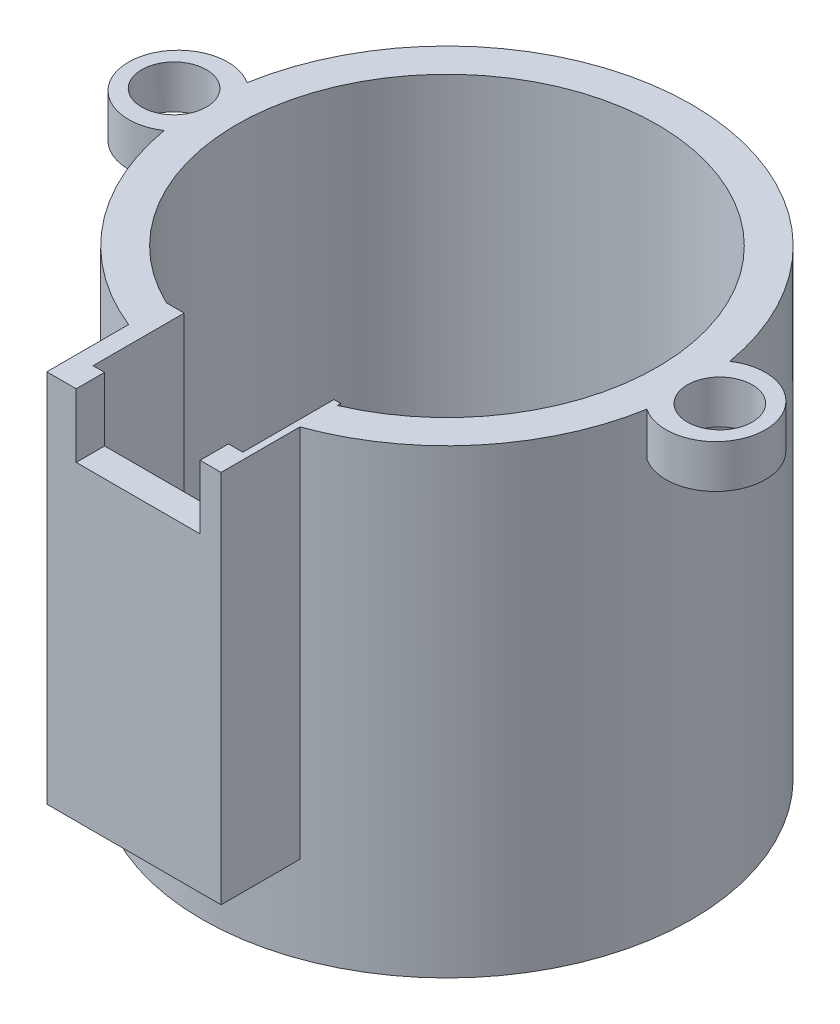
ISO-10303-21;
HEADER;
FILE_DESCRIPTION(('STEP AP214'),'2;1');
FILE_NAME('part.step','',(''),(''),'','','');
FILE_SCHEMA(('AUTOMOTIVE_DESIGN { 1 0 10303 214 1 1 1 1 }'));
ENDSEC;
DATA;
#1=APPLICATION_CONTEXT('core data for automotive mechanical design processes');
#2=APPLICATION_PROTOCOL_DEFINITION('international standard','automotive_design',2000,#1);
#3=PRODUCT_CONTEXT('',#1,'mechanical');
#4=PRODUCT('Part','Part','',(#3));
#5=PRODUCT_RELATED_PRODUCT_CATEGORY('part','',(#4));
#6=PRODUCT_DEFINITION_FORMATION('','',#4);
#7=PRODUCT_DEFINITION_CONTEXT('part definition',#1,'design');
#8=PRODUCT_DEFINITION('design','',#6,#7);
#9=PRODUCT_DEFINITION_SHAPE('','',#8);
#10=(LENGTH_UNIT() NAMED_UNIT(*) SI_UNIT(.MILLI.,.METRE.));
#11=(NAMED_UNIT(*) PLANE_ANGLE_UNIT() SI_UNIT($,.RADIAN.));
#12=(NAMED_UNIT(*) SI_UNIT($,.STERADIAN.) SOLID_ANGLE_UNIT());
#13=UNCERTAINTY_MEASURE_WITH_UNIT(LENGTH_MEASURE(1.E-05),#10,'distance_accuracy_value','');
#14=(GEOMETRIC_REPRESENTATION_CONTEXT(3) GLOBAL_UNCERTAINTY_ASSIGNED_CONTEXT((#13)) GLOBAL_UNIT_ASSIGNED_CONTEXT((#10,
#11,#12)) REPRESENTATION_CONTEXT('',''));
#15=CARTESIAN_POINT('',(0.,0.,0.));
#16=DIRECTION('',(0.,0.,1.));
#17=DIRECTION('',(1.,0.,0.));
#18=AXIS2_PLACEMENT_3D('',#15,#16,#17);
#19=CARTESIAN_POINT('',(0.,32.,0.));
#20=DIRECTION('',(0.,-1.,0.));
#21=DIRECTION('',(0.,0.,-1.));
#22=AXIS2_PLACEMENT_3D('',#19,#20,#21);
#23=CYLINDRICAL_SURFACE('',#22,17.);
#24=CARTESIAN_POINT('',(0.,6.,0.));
#25=DIRECTION('',(0.,1.,0.));
#26=DIRECTION('',(0.,0.,1.));
#27=AXIS2_PLACEMENT_3D('',#24,#25,#26);
#28=CIRCLE('',#27,17.);
#29=CARTESIAN_POINT('',(-6.32187584359508,6.,15.7808075147683));
#30=VERTEX_POINT('',#29);
#31=CARTESIAN_POINT('',(5.77812415640491,6.,15.9879104711394));
#32=VERTEX_POINT('',#31);
#33=EDGE_CURVE('E281',#30,#32,#28,.T.);
#34=ORIENTED_EDGE('',*,*,#33,.F.);
#35=DIRECTION('',(0.,-1.,0.));
#36=VECTOR('',#35,1.);
#37=CARTESIAN_POINT('',(-6.32187584359508,32.,15.7808075147683));
#38=LINE('',#37,#36);
#39=CARTESIAN_POINT('',(-6.32187584359508,32.,15.7808075147683));
#40=VERTEX_POINT('',#39);
#41=EDGE_CURVE('E299',#30,#40,#38,.F.);
#42=ORIENTED_EDGE('',*,*,#41,.T.);
#43=CARTESIAN_POINT('',(0.,32.,0.));
#44=DIRECTION('',(0.,1.,0.));
#45=DIRECTION('',(0.,0.,1.));
#46=AXIS2_PLACEMENT_3D('',#43,#44,#45);
#47=CIRCLE('',#46,17.);
#48=CARTESIAN_POINT('',(-16.7548421095073,32.,2.87667618710923));
#49=VERTEX_POINT('',#48);
#50=EDGE_CURVE('E358',#49,#40,#47,.T.);
#51=ORIENTED_EDGE('',*,*,#50,.F.);
#52=DIRECTION('',(0.,1.,0.));
#53=VECTOR('',#52,1.);
#54=CARTESIAN_POINT('',(-16.7548421095073,30.5,2.87667618710924));
#55=LINE('',#54,#53);
#56=CARTESIAN_POINT('',(-16.7548421095073,29.,2.87667618710924));
#57=VERTEX_POINT('',#56);
#58=EDGE_CURVE('E339',#49,#57,#55,.F.);
#59=ORIENTED_EDGE('',*,*,#58,.T.);
#60=CARTESIAN_POINT('',(0.,29.,0.));
#61=DIRECTION('',(0.,-1.,0.));
#62=DIRECTION('',(0.,0.,-1.));
#63=AXIS2_PLACEMENT_3D('',#60,#61,#62);
#64=CIRCLE('',#63,17.);
#65=CARTESIAN_POINT('',(-16.966389559601,29.,1.06846867612629));
#66=VERTEX_POINT('',#65);
#67=EDGE_CURVE('E368',#57,#66,#64,.T.);
#68=ORIENTED_EDGE('',*,*,#67,.T.);
#69=CARTESIAN_POINT('',(-16.966389559601,29.,-1.0684686761263));
#70=VERTEX_POINT('',#69);
#71=EDGE_CURVE('E373',#66,#70,#64,.T.);
#72=ORIENTED_EDGE('',*,*,#71,.T.);
#73=CARTESIAN_POINT('',(-16.7548421095073,29.,-2.87667618710924));
#74=VERTEX_POINT('',#73);
#75=EDGE_CURVE('E362',#70,#74,#64,.T.);
#76=ORIENTED_EDGE('',*,*,#75,.T.);
#77=DIRECTION('',(0.,1.,0.));
#78=VECTOR('',#77,1.);
#79=CARTESIAN_POINT('',(-16.7548421095073,30.5,-2.87667618710924));
#80=LINE('',#79,#78);
#81=CARTESIAN_POINT('',(-16.7548421095073,32.,-2.87667618710924));
#82=VERTEX_POINT('',#81);
#83=EDGE_CURVE('E345',#74,#82,#80,.T.);
#84=ORIENTED_EDGE('',*,*,#83,.T.);
#85=CARTESIAN_POINT('',(16.7548421095073,32.,-2.87667618710923));
#86=VERTEX_POINT('',#85);
#87=EDGE_CURVE('E364',#86,#82,#47,.T.);
#88=ORIENTED_EDGE('',*,*,#87,.F.);
#89=DIRECTION('',(0.,1.,0.));
#90=VECTOR('',#89,1.);
#91=CARTESIAN_POINT('',(16.7548421095073,30.5,-2.87667618710924));
#92=LINE('',#91,#90);
#93=CARTESIAN_POINT('',(16.7548421095073,29.,-2.87667618710924));
#94=VERTEX_POINT('',#93);
#95=EDGE_CURVE('E324',#86,#94,#92,.F.);
#96=ORIENTED_EDGE('',*,*,#95,.T.);
#97=CARTESIAN_POINT('',(0.,29.,0.));
#98=DIRECTION('',(0.,1.,0.));
#99=DIRECTION('',(0.,0.,1.));
#100=AXIS2_PLACEMENT_3D('',#97,#98,#99);
#101=CIRCLE('',#100,17.);
#102=CARTESIAN_POINT('',(16.966389559601,29.,-1.06846867612629));
#103=VERTEX_POINT('',#102);
#104=EDGE_CURVE('E372',#103,#94,#101,.T.);
#105=ORIENTED_EDGE('',*,*,#104,.F.);
#106=CARTESIAN_POINT('',(16.966389559601,29.,1.0684686761263));
#107=VERTEX_POINT('',#106);
#108=EDGE_CURVE('E379',#107,#103,#101,.T.);
#109=ORIENTED_EDGE('',*,*,#108,.F.);
#110=CARTESIAN_POINT('',(16.7548421095073,29.,2.87667618710924));
#111=VERTEX_POINT('',#110);
#112=EDGE_CURVE('E374',#111,#107,#101,.T.);
#113=ORIENTED_EDGE('',*,*,#112,.F.);
#114=DIRECTION('',(0.,1.,0.));
#115=VECTOR('',#114,1.);
#116=CARTESIAN_POINT('',(16.7548421095073,30.5,2.87667618710924));
#117=LINE('',#116,#115);
#118=CARTESIAN_POINT('',(16.7548421095073,32.,2.87667618710924));
#119=VERTEX_POINT('',#118);
#120=EDGE_CURVE('E330',#111,#119,#117,.T.);
#121=ORIENTED_EDGE('',*,*,#120,.T.);
#122=CARTESIAN_POINT('',(5.77812415640492,32.,15.9879104711394));
#123=VERTEX_POINT('',#122);
#124=EDGE_CURVE('E363',#123,#119,#47,.T.);
#125=ORIENTED_EDGE('',*,*,#124,.F.);
#126=DIRECTION('',(0.,-1.,0.));
#127=VECTOR('',#126,1.);
#128=CARTESIAN_POINT('',(5.77812415640492,32.,15.9879104711394));
#129=LINE('',#128,#127);
#130=EDGE_CURVE('E295',#123,#32,#129,.T.);
#131=ORIENTED_EDGE('',*,*,#130,.T.);
#132=EDGE_LOOP('',(#34,#42,#51,#59,#68,#72,#76,#84,#88,#96,#105,#109,#113,#121,#125,#131));
#133=FACE_BOUND('',#132,.T.);
#134=CARTESIAN_POINT('',(0.,0.,0.));
#135=DIRECTION('',(0.,1.,0.));
#136=DIRECTION('',(0.,0.,1.));
#137=AXIS2_PLACEMENT_3D('',#134,#135,#136);
#138=CIRCLE('',#137,17.);
#139=CARTESIAN_POINT('',(0.,0.,17.));
#140=VERTEX_POINT('',#139);
#141=EDGE_CURVE('E357',#140,#140,#138,.T.);
#142=ORIENTED_EDGE('',*,*,#141,.T.);
#143=EDGE_LOOP('',(#142));
#144=FACE_BOUND('',#143,.T.);
#145=ADVANCED_FACE('F39',(#133,#144),#23,.T.);
#146=CARTESIAN_POINT('',(0.,32.,0.));
#147=DIRECTION('',(0.,1.,0.));
#148=DIRECTION('',(0.,0.,1.));
#149=AXIS2_PLACEMENT_3D('',#146,#147,#148);
#150=PLANE('',#149);
#151=DIRECTION('',(0.,0.,1.));
#152=VECTOR('',#151,1.);
#153=CARTESIAN_POINT('',(-4.28048175942595,32.,0.));
#154=LINE('',#153,#152);
#155=CARTESIAN_POINT('',(-4.28048175942595,32.,19.4895629590559));
#156=VERTEX_POINT('',#155);
#157=CARTESIAN_POINT('',(-4.28048175942595,32.,21.4603148069554));
#158=VERTEX_POINT('',#157);
#159=EDGE_CURVE('E188',#156,#158,#154,.T.);
#160=ORIENTED_EDGE('',*,*,#159,.F.);
#161=DIRECTION('',(1.,0.,0.));
#162=VECTOR('',#161,1.);
#163=CARTESIAN_POINT('',(-5.08337699742542,32.,19.4895629590559));
#164=LINE('',#163,#162);
#165=CARTESIAN_POINT('',(-5.08337699742542,32.,19.4895629590559));
#166=VERTEX_POINT('',#165);
#167=EDGE_CURVE('E231',#166,#156,#164,.T.);
#168=ORIENTED_EDGE('',*,*,#167,.F.);
#169=DIRECTION('',(0.,0.,1.));
#170=VECTOR('',#169,1.);
#171=CARTESIAN_POINT('',(-5.08337699742542,32.,19.4895629590559));
#172=LINE('',#171,#170);
#173=CARTESIAN_POINT('',(-5.08337699742542,32.,13.1603148069554));
#174=VERTEX_POINT('',#173);
#175=EDGE_CURVE('E217',#174,#166,#172,.T.);
#176=ORIENTED_EDGE('',*,*,#175,.F.);
#177=DIRECTION('',(-1.,0.,0.));
#178=VECTOR('',#177,1.);
#179=CARTESIAN_POINT('',(-6.32187584359508,32.,13.1603148069554));
#180=LINE('',#179,#178);
#181=CARTESIAN_POINT('',(-6.32187584359508,32.,13.1603148069554));
#182=VERTEX_POINT('',#181);
#183=EDGE_CURVE('E273',#174,#182,#180,.T.);
#184=ORIENTED_EDGE('',*,*,#183,.T.);
#185=CARTESIAN_POINT('',(0.,32.,0.));
#186=DIRECTION('',(0.,1.,0.));
#187=DIRECTION('',(0.,0.,1.));
#188=AXIS2_PLACEMENT_3D('',#185,#186,#187);
#189=CIRCLE('',#188,14.6);
#190=CARTESIAN_POINT('',(5.77812415640491,32.,13.4079558931692));
#191=VERTEX_POINT('',#190);
#192=EDGE_CURVE('E353',#191,#182,#189,.T.);
#193=ORIENTED_EDGE('',*,*,#192,.F.);
#194=DIRECTION('',(0.,0.,-1.));
#195=VECTOR('',#194,1.);
#196=CARTESIAN_POINT('',(5.77812415640492,32.,13.1603148069554));
#197=LINE('',#196,#195);
#198=CARTESIAN_POINT('',(5.77812415640492,32.,13.1603148069554));
#199=VERTEX_POINT('',#198);
#200=EDGE_CURVE('E269',#191,#199,#197,.T.);
#201=ORIENTED_EDGE('',*,*,#200,.T.);
#202=CARTESIAN_POINT('',(5.31662300257458,32.,13.1603148069554));
#203=VERTEX_POINT('',#202);
#204=EDGE_CURVE('E249',#199,#203,#180,.T.);
#205=ORIENTED_EDGE('',*,*,#204,.T.);
#206=DIRECTION('',(0.,0.,-1.));
#207=VECTOR('',#206,1.);
#208=CARTESIAN_POINT('',(5.31662300257458,32.,19.4895629590559));
#209=LINE('',#208,#207);
#210=CARTESIAN_POINT('',(5.31662300257458,32.,19.4895629590559));
#211=VERTEX_POINT('',#210);
#212=EDGE_CURVE('E222',#211,#203,#209,.T.);
#213=ORIENTED_EDGE('',*,*,#212,.F.);
#214=CARTESIAN_POINT('',(4.31951824057405,32.,19.4895629590559));
#215=VERTEX_POINT('',#214);
#216=EDGE_CURVE('E230',#215,#211,#164,.T.);
#217=ORIENTED_EDGE('',*,*,#216,.F.);
#218=DIRECTION('',(0.,0.,-1.));
#219=VECTOR('',#218,1.);
#220=CARTESIAN_POINT('',(4.31951824057405,32.,0.));
#221=LINE('',#220,#219);
#222=CARTESIAN_POINT('',(4.31951824057405,32.,21.4603148069554));
#223=VERTEX_POINT('',#222);
#224=EDGE_CURVE('E211',#223,#215,#221,.T.);
#225=ORIENTED_EDGE('',*,*,#224,.F.);
#226=DIRECTION('',(1.,0.,0.));
#227=VECTOR('',#226,1.);
#228=CARTESIAN_POINT('',(-6.32187584359508,32.,21.4603148069554));
#229=LINE('',#228,#227);
#230=CARTESIAN_POINT('',(5.77812415640492,32.,21.4603148069554));
#231=VERTEX_POINT('',#230);
#232=EDGE_CURVE('E265',#223,#231,#229,.T.);
#233=ORIENTED_EDGE('',*,*,#232,.T.);
#234=EDGE_CURVE('E270',#231,#123,#197,.T.);
#235=ORIENTED_EDGE('',*,*,#234,.T.);
#236=ORIENTED_EDGE('',*,*,#124,.T.);
#237=CARTESIAN_POINT('',(18.6593720028192,32.,0.));
#238=DIRECTION('',(0.,1.,0.));
#239=DIRECTION('',(0.,0.,1.));
#240=AXIS2_PLACEMENT_3D('',#237,#238,#239);
#241=CIRCLE('',#240,3.45);
#242=EDGE_CURVE('E308',#119,#86,#241,.T.);
#243=ORIENTED_EDGE('',*,*,#242,.T.);
#244=ORIENTED_EDGE('',*,*,#87,.T.);
#245=CARTESIAN_POINT('',(-18.6593720028192,32.,0.));
#246=DIRECTION('',(0.,1.,0.));
#247=DIRECTION('',(0.,0.,-1.));
#248=AXIS2_PLACEMENT_3D('',#245,#246,#247);
#249=CIRCLE('',#248,3.45);
#250=EDGE_CURVE('E334',#82,#49,#249,.T.);
#251=ORIENTED_EDGE('',*,*,#250,.T.);
#252=ORIENTED_EDGE('',*,*,#50,.T.);
#253=DIRECTION('',(0.,0.,1.));
#254=VECTOR('',#253,1.);
#255=CARTESIAN_POINT('',(-6.32187584359508,32.,13.1603148069554));
#256=LINE('',#255,#254);
#257=CARTESIAN_POINT('',(-6.32187584359508,32.,21.4603148069554));
#258=VERTEX_POINT('',#257);
#259=EDGE_CURVE('E241',#40,#258,#256,.T.);
#260=ORIENTED_EDGE('',*,*,#259,.T.);
#261=EDGE_CURVE('E266',#258,#158,#229,.T.);
#262=ORIENTED_EDGE('',*,*,#261,.T.);
#263=EDGE_LOOP('',(#160,#168,#176,#184,#193,#201,#205,#213,#217,#225,#233,#235,#236,#243,#244,
#251,#252,#260,#262));
#264=FACE_BOUND('',#263,.T.);
#265=CARTESIAN_POINT('',(18.9465094267143,32.,0.));
#266=DIRECTION('',(0.,1.,0.));
#267=DIRECTION('',(0.,0.,1.));
#268=AXIS2_PLACEMENT_3D('',#265,#266,#267);
#269=CIRCLE('',#268,2.25);
#270=CARTESIAN_POINT('',(18.9465094267143,32.,2.25));
#271=VERTEX_POINT('',#270);
#272=EDGE_CURVE('E309',#271,#271,#269,.T.);
#273=ORIENTED_EDGE('',*,*,#272,.F.);
#274=EDGE_LOOP('',(#273));
#275=FACE_BOUND('',#274,.T.);
#276=CARTESIAN_POINT('',(-18.9465094267143,32.,0.));
#277=DIRECTION('',(0.,1.,0.));
#278=DIRECTION('',(0.,0.,-1.));
#279=AXIS2_PLACEMENT_3D('',#276,#277,#278);
#280=CIRCLE('',#279,2.25);
#281=CARTESIAN_POINT('',(-18.9465094267143,32.,-2.25));
#282=VERTEX_POINT('',#281);
#283=EDGE_CURVE('E303',#282,#282,#280,.T.);
#284=ORIENTED_EDGE('',*,*,#283,.F.);
#285=EDGE_LOOP('',(#284));
#286=FACE_BOUND('',#285,.T.);
#287=ADVANCED_FACE('F412',(#264,#275,#286),#150,.T.);
#288=CARTESIAN_POINT('',(0.,0.,0.));
#289=DIRECTION('',(0.,1.,0.));
#290=DIRECTION('',(0.,0.,1.));
#291=AXIS2_PLACEMENT_3D('',#288,#289,#290);
#292=PLANE('',#291);
#293=ORIENTED_EDGE('',*,*,#141,.F.);
#294=EDGE_LOOP('',(#293));
#295=FACE_BOUND('',#294,.T.);
#296=ADVANCED_FACE('F488',(#295),#292,.F.);
#297=CARTESIAN_POINT('',(0.,32.,0.));
#298=DIRECTION('',(0.,-1.,0.));
#299=DIRECTION('',(0.,0.,-1.));
#300=AXIS2_PLACEMENT_3D('',#297,#298,#299);
#301=CYLINDRICAL_SURFACE('',#300,14.6);
#302=DIRECTION('',(0.,1.,0.));
#303=VECTOR('',#302,1.);
#304=CARTESIAN_POINT('',(-6.32187584359508,6.,13.1603148069554));
#305=LINE('',#304,#303);
#306=CARTESIAN_POINT('',(-6.32187584359508,6.,13.1603148069554));
#307=VERTEX_POINT('',#306);
#308=EDGE_CURVE('E277',#307,#182,#305,.T.);
#309=ORIENTED_EDGE('',*,*,#308,.F.);
#310=CARTESIAN_POINT('',(0.,6.,0.));
#311=DIRECTION('',(0.,1.,0.));
#312=DIRECTION('',(0.,0.,1.));
#313=AXIS2_PLACEMENT_3D('',#310,#311,#312);
#314=CIRCLE('',#313,14.6);
#315=CARTESIAN_POINT('',(5.77812415640491,6.,13.4079558931692));
#316=VERTEX_POINT('',#315);
#317=EDGE_CURVE('E386',#307,#316,#314,.T.);
#318=ORIENTED_EDGE('',*,*,#317,.T.);
#319=DIRECTION('',(0.,-1.,0.));
#320=VECTOR('',#319,1.);
#321=CARTESIAN_POINT('',(5.77812415640492,32.,13.4079558931692));
#322=LINE('',#321,#320);
#323=EDGE_CURVE('E389',#191,#316,#322,.T.);
#324=ORIENTED_EDGE('',*,*,#323,.F.);
#325=ORIENTED_EDGE('',*,*,#192,.T.);
#326=EDGE_LOOP('',(#309,#318,#324,#325));
#327=FACE_BOUND('',#326,.T.);
#328=CARTESIAN_POINT('',(0.,2.4,0.));
#329=DIRECTION('',(0.,1.,0.));
#330=DIRECTION('',(0.,0.,1.));
#331=AXIS2_PLACEMENT_3D('',#328,#329,#330);
#332=CIRCLE('',#331,14.6);
#333=CARTESIAN_POINT('',(0.,2.4,14.6));
#334=VERTEX_POINT('',#333);
#335=EDGE_CURVE('E349',#334,#334,#332,.T.);
#336=ORIENTED_EDGE('',*,*,#335,.F.);
#337=EDGE_LOOP('',(#336));
#338=FACE_BOUND('',#337,.T.);
#339=ADVANCED_FACE('F493',(#327,#338),#301,.F.);
#340=CARTESIAN_POINT('',(0.,2.4,0.));
#341=DIRECTION('',(0.,1.,0.));
#342=DIRECTION('',(0.,0.,1.));
#343=AXIS2_PLACEMENT_3D('',#340,#341,#342);
#344=PLANE('',#343);
#345=ORIENTED_EDGE('',*,*,#335,.T.);
#346=EDGE_LOOP('',(#345));
#347=FACE_BOUND('',#346,.T.);
#348=ADVANCED_FACE('F496',(#347),#344,.T.);
#349=CARTESIAN_POINT('',(-18.6593720028192,29.,0.));
#350=DIRECTION('',(0.,1.,0.));
#351=DIRECTION('',(0.,0.,1.));
#352=AXIS2_PLACEMENT_3D('',#349,#350,#351);
#353=CYLINDRICAL_SURFACE('',#352,3.45);
#354=ORIENTED_EDGE('',*,*,#83,.F.);
#355=CARTESIAN_POINT('',(-18.6593720028192,29.,0.));
#356=DIRECTION('',(0.,1.,0.));
#357=DIRECTION('',(0.,0.,-1.));
#358=AXIS2_PLACEMENT_3D('',#355,#356,#357);
#359=CIRCLE('',#358,3.45);
#360=EDGE_CURVE('E335',#74,#57,#359,.T.);
#361=ORIENTED_EDGE('',*,*,#360,.T.);
#362=ORIENTED_EDGE('',*,*,#58,.F.);
#363=ORIENTED_EDGE('',*,*,#250,.F.);
#364=EDGE_LOOP('',(#354,#361,#362,#363));
#365=FACE_BOUND('',#364,.T.);
#366=ADVANCED_FACE('F462',(#365),#353,.T.);
#367=CARTESIAN_POINT('',(-18.6593720028192,29.,0.));
#368=DIRECTION('',(0.,-1.,0.));
#369=DIRECTION('',(0.,0.,-1.));
#370=AXIS2_PLACEMENT_3D('',#367,#368,#369);
#371=PLANE('',#370);
#372=CARTESIAN_POINT('',(-18.9465094267143,29.,0.));
#373=DIRECTION('',(0.,-1.,0.));
#374=DIRECTION('',(0.,0.,-1.));
#375=AXIS2_PLACEMENT_3D('',#372,#373,#374);
#376=CIRCLE('',#375,2.25);
#377=EDGE_CURVE('E383',#66,#70,#376,.T.);
#378=ORIENTED_EDGE('',*,*,#377,.F.);
#379=ORIENTED_EDGE('',*,*,#67,.F.);
#380=ORIENTED_EDGE('',*,*,#360,.F.);
#381=ORIENTED_EDGE('',*,*,#75,.F.);
#382=EDGE_LOOP('',(#378,#379,#380,#381));
#383=FACE_BOUND('',#382,.T.);
#384=ADVANCED_FACE('F467',(#383),#371,.T.);
#385=CARTESIAN_POINT('',(18.6593720028192,29.,0.));
#386=DIRECTION('',(0.,1.,0.));
#387=DIRECTION('',(0.,0.,1.));
#388=AXIS2_PLACEMENT_3D('',#385,#386,#387);
#389=CYLINDRICAL_SURFACE('',#388,3.45);
#390=ORIENTED_EDGE('',*,*,#120,.F.);
#391=CARTESIAN_POINT('',(18.6593720028192,29.,0.));
#392=DIRECTION('',(0.,1.,0.));
#393=DIRECTION('',(0.,0.,1.));
#394=AXIS2_PLACEMENT_3D('',#391,#392,#393);
#395=CIRCLE('',#394,3.45);
#396=EDGE_CURVE('E320',#111,#94,#395,.T.);
#397=ORIENTED_EDGE('',*,*,#396,.T.);
#398=ORIENTED_EDGE('',*,*,#95,.F.);
#399=ORIENTED_EDGE('',*,*,#242,.F.);
#400=EDGE_LOOP('',(#390,#397,#398,#399));
#401=FACE_BOUND('',#400,.T.);
#402=ADVANCED_FACE('F443',(#401),#389,.T.);
#403=CARTESIAN_POINT('',(18.6593720028192,29.,0.));
#404=DIRECTION('',(0.,1.,0.));
#405=DIRECTION('',(0.,0.,1.));
#406=AXIS2_PLACEMENT_3D('',#403,#404,#405);
#407=PLANE('',#406);
#408=ORIENTED_EDGE('',*,*,#112,.T.);
#409=CARTESIAN_POINT('',(18.9465094267143,29.,0.));
#410=DIRECTION('',(0.,1.,0.));
#411=DIRECTION('',(0.,0.,1.));
#412=AXIS2_PLACEMENT_3D('',#409,#410,#411);
#413=CIRCLE('',#412,2.25);
#414=EDGE_CURVE('E378',#107,#103,#413,.T.);
#415=ORIENTED_EDGE('',*,*,#414,.T.);
#416=ORIENTED_EDGE('',*,*,#104,.T.);
#417=ORIENTED_EDGE('',*,*,#396,.F.);
#418=EDGE_LOOP('',(#408,#415,#416,#417));
#419=FACE_BOUND('',#418,.T.);
#420=ADVANCED_FACE('F434',(#419),#407,.F.);
#421=CARTESIAN_POINT('',(18.9465094267143,29.,0.));
#422=DIRECTION('',(0.,1.,0.));
#423=DIRECTION('',(0.,0.,1.));
#424=AXIS2_PLACEMENT_3D('',#421,#422,#423);
#425=PLANE('',#424);
#426=ORIENTED_EDGE('',*,*,#108,.T.);
#427=CARTESIAN_POINT('',(18.9465094267143,29.,0.));
#428=DIRECTION('',(0.,1.,0.));
#429=DIRECTION('',(0.,0.,1.));
#430=AXIS2_PLACEMENT_3D('',#427,#428,#429);
#431=CIRCLE('',#430,2.25);
#432=EDGE_CURVE('E304',#103,#107,#431,.T.);
#433=ORIENTED_EDGE('',*,*,#432,.T.);
#434=EDGE_LOOP('',(#426,#433));
#435=FACE_BOUND('',#434,.T.);
#436=ADVANCED_FACE('F429',(#435),#425,.T.);
#437=CARTESIAN_POINT('',(18.9465094267143,29.,0.));
#438=DIRECTION('',(0.,1.,0.));
#439=DIRECTION('',(0.,0.,1.));
#440=AXIS2_PLACEMENT_3D('',#437,#438,#439);
#441=CYLINDRICAL_SURFACE('',#440,2.25);
#442=ORIENTED_EDGE('',*,*,#432,.F.);
#443=ORIENTED_EDGE('',*,*,#414,.F.);
#444=EDGE_LOOP('',(#442,#443));
#445=FACE_BOUND('',#444,.T.);
#446=ORIENTED_EDGE('',*,*,#272,.T.);
#447=EDGE_LOOP('',(#446));
#448=FACE_BOUND('',#447,.T.);
#449=ADVANCED_FACE('F475',(#445,#448),#441,.F.);
#450=CARTESIAN_POINT('',(-18.9465094267143,29.,0.));
#451=DIRECTION('',(0.,-1.,0.));
#452=DIRECTION('',(0.,0.,-1.));
#453=AXIS2_PLACEMENT_3D('',#450,#451,#452);
#454=PLANE('',#453);
#455=CARTESIAN_POINT('',(-18.9465094267143,29.,0.));
#456=DIRECTION('',(0.,1.,0.));
#457=DIRECTION('',(0.,0.,-1.));
#458=AXIS2_PLACEMENT_3D('',#455,#456,#457);
#459=CIRCLE('',#458,2.25);
#460=EDGE_CURVE('E313',#66,#70,#459,.T.);
#461=ORIENTED_EDGE('',*,*,#460,.T.);
#462=ORIENTED_EDGE('',*,*,#71,.F.);
#463=EDGE_LOOP('',(#461,#462));
#464=FACE_BOUND('',#463,.T.);
#465=ADVANCED_FACE('F473',(#464),#454,.F.);
#466=CARTESIAN_POINT('',(-18.9465094267143,29.,0.));
#467=DIRECTION('',(0.,1.,0.));
#468=DIRECTION('',(0.,0.,1.));
#469=AXIS2_PLACEMENT_3D('',#466,#467,#468);
#470=CYLINDRICAL_SURFACE('',#469,2.25);
#471=ORIENTED_EDGE('',*,*,#460,.F.);
#472=ORIENTED_EDGE('',*,*,#377,.T.);
#473=EDGE_LOOP('',(#471,#472));
#474=FACE_BOUND('',#473,.T.);
#475=ORIENTED_EDGE('',*,*,#283,.T.);
#476=EDGE_LOOP('',(#475));
#477=FACE_BOUND('',#476,.T.);
#478=ADVANCED_FACE('F470',(#474,#477),#470,.F.);
#479=CARTESIAN_POINT('',(0.,6.,0.));
#480=DIRECTION('',(0.,1.,0.));
#481=DIRECTION('',(0.,0.,1.));
#482=AXIS2_PLACEMENT_3D('',#479,#480,#481);
#483=PLANE('',#482);
#484=ORIENTED_EDGE('',*,*,#317,.F.);
#485=DIRECTION('',(-1.,0.,0.));
#486=VECTOR('',#485,1.);
#487=CARTESIAN_POINT('',(-6.32187584359508,6.,13.1603148069554));
#488=LINE('',#487,#486);
#489=CARTESIAN_POINT('',(5.77812415640492,6.,13.1603148069554));
#490=VERTEX_POINT('',#489);
#491=EDGE_CURVE('E258',#490,#307,#488,.T.);
#492=ORIENTED_EDGE('',*,*,#491,.F.);
#493=DIRECTION('',(0.,0.,-1.));
#494=VECTOR('',#493,1.);
#495=CARTESIAN_POINT('',(5.77812415640492,6.,13.1603148069554));
#496=LINE('',#495,#494);
#497=EDGE_CURVE('E253',#316,#490,#496,.T.);
#498=ORIENTED_EDGE('',*,*,#497,.F.);
#499=EDGE_LOOP('',(#484,#492,#498));
#500=FACE_BOUND('',#499,.T.);
#501=ADVANCED_FACE('F481',(#500),#483,.F.);
#502=CARTESIAN_POINT('',(5.77812415640492,6.,13.1603148069554));
#503=DIRECTION('',(1.,0.,0.));
#504=DIRECTION('',(0.,0.,-1.));
#505=AXIS2_PLACEMENT_3D('',#502,#503,#504);
#506=PLANE('',#505);
#507=ORIENTED_EDGE('',*,*,#200,.F.);
#508=ORIENTED_EDGE('',*,*,#323,.T.);
#509=ORIENTED_EDGE('',*,*,#497,.T.);
#510=DIRECTION('',(0.,1.,0.));
#511=VECTOR('',#510,1.);
#512=CARTESIAN_POINT('',(5.77812415640492,6.,13.1603148069554));
#513=LINE('',#512,#511);
#514=EDGE_CURVE('E282',#490,#199,#513,.T.);
#515=ORIENTED_EDGE('',*,*,#514,.T.);
#516=EDGE_LOOP('',(#507,#508,#509,#515));
#517=FACE_BOUND('',#516,.T.);
#518=ADVANCED_FACE('F522',(#517),#506,.T.);
#519=CARTESIAN_POINT('',(-6.32187584359508,6.,13.1603148069554));
#520=DIRECTION('',(0.,0.,-1.));
#521=DIRECTION('',(-1.,0.,0.));
#522=AXIS2_PLACEMENT_3D('',#519,#520,#521);
#523=PLANE('',#522);
#524=DIRECTION('',(0.,1.,0.));
#525=VECTOR('',#524,1.);
#526=CARTESIAN_POINT('',(-5.08337699742542,6.,13.1603148069554));
#527=LINE('',#526,#525);
#528=CARTESIAN_POINT('',(-5.08337699742542,7.,13.1603148069554));
#529=VERTEX_POINT('',#528);
#530=EDGE_CURVE('E399',#529,#174,#527,.T.);
#531=ORIENTED_EDGE('',*,*,#530,.F.);
#532=DIRECTION('',(-1.,0.,0.));
#533=VECTOR('',#532,1.);
#534=CARTESIAN_POINT('',(-6.32187584359508,7.,13.1603148069554));
#535=LINE('',#534,#533);
#536=CARTESIAN_POINT('',(5.31662300257458,7.,13.1603148069554));
#537=VERTEX_POINT('',#536);
#538=EDGE_CURVE('E393',#537,#529,#535,.T.);
#539=ORIENTED_EDGE('',*,*,#538,.F.);
#540=DIRECTION('',(0.,-1.,0.));
#541=VECTOR('',#540,1.);
#542=CARTESIAN_POINT('',(5.31662300257458,6.,13.1603148069554));
#543=LINE('',#542,#541);
#544=EDGE_CURVE('E396',#203,#537,#543,.T.);
#545=ORIENTED_EDGE('',*,*,#544,.F.);
#546=ORIENTED_EDGE('',*,*,#204,.F.);
#547=ORIENTED_EDGE('',*,*,#514,.F.);
#548=ORIENTED_EDGE('',*,*,#491,.T.);
#549=ORIENTED_EDGE('',*,*,#308,.T.);
#550=ORIENTED_EDGE('',*,*,#183,.F.);
#551=EDGE_LOOP('',(#531,#539,#545,#546,#547,#548,#549,#550));
#552=FACE_BOUND('',#551,.T.);
#553=ADVANCED_FACE('F519',(#552),#523,.T.);
#554=CARTESIAN_POINT('',(-6.32187584359508,6.,13.1603148069554));
#555=DIRECTION('',(-1.,0.,0.));
#556=DIRECTION('',(0.,0.,1.));
#557=AXIS2_PLACEMENT_3D('',#554,#555,#556);
#558=PLANE('',#557);
#559=ORIENTED_EDGE('',*,*,#41,.F.);
#560=DIRECTION('',(0.,0.,1.));
#561=VECTOR('',#560,1.);
#562=CARTESIAN_POINT('',(-6.32187584359508,6.,13.1603148069554));
#563=LINE('',#562,#561);
#564=CARTESIAN_POINT('',(-6.32187584359508,6.,21.4603148069554));
#565=VERTEX_POINT('',#564);
#566=EDGE_CURVE('E245',#30,#565,#563,.T.);
#567=ORIENTED_EDGE('',*,*,#566,.T.);
#568=DIRECTION('',(0.,1.,0.));
#569=VECTOR('',#568,1.);
#570=CARTESIAN_POINT('',(-6.32187584359508,6.,21.4603148069554));
#571=LINE('',#570,#569);
#572=EDGE_CURVE('E262',#565,#258,#571,.T.);
#573=ORIENTED_EDGE('',*,*,#572,.T.);
#574=ORIENTED_EDGE('',*,*,#259,.F.);
#575=EDGE_LOOP('',(#559,#567,#573,#574));
#576=FACE_BOUND('',#575,.T.);
#577=ADVANCED_FACE('F456',(#576),#558,.T.);
#578=ORIENTED_EDGE('',*,*,#130,.F.);
#579=ORIENTED_EDGE('',*,*,#234,.F.);
#580=DIRECTION('',(0.,1.,0.));
#581=VECTOR('',#580,1.);
#582=CARTESIAN_POINT('',(5.77812415640492,6.,21.4603148069554));
#583=LINE('',#582,#581);
#584=CARTESIAN_POINT('',(5.77812415640492,6.,21.4603148069554));
#585=VERTEX_POINT('',#584);
#586=EDGE_CURVE('E286',#585,#231,#583,.T.);
#587=ORIENTED_EDGE('',*,*,#586,.F.);
#588=EDGE_CURVE('E254',#585,#32,#496,.T.);
#589=ORIENTED_EDGE('',*,*,#588,.T.);
#590=EDGE_LOOP('',(#578,#579,#587,#589));
#591=FACE_BOUND('',#590,.T.);
#592=ADVANCED_FACE('F448',(#591),#506,.T.);
#593=CARTESIAN_POINT('',(-6.32187584359508,6.,21.4603148069554));
#594=DIRECTION('',(0.,0.,1.));
#595=DIRECTION('',(1.,0.,0.));
#596=AXIS2_PLACEMENT_3D('',#593,#594,#595);
#597=PLANE('',#596);
#598=DIRECTION('',(0.,-1.,0.));
#599=VECTOR('',#598,1.);
#600=CARTESIAN_POINT('',(-4.28048175942595,27.572573951939,21.4603148069554));
#601=LINE('',#600,#599);
#602=CARTESIAN_POINT('',(-4.28048175942595,27.572573951939,21.4603148069554));
#603=VERTEX_POINT('',#602);
#604=EDGE_CURVE('E183',#158,#603,#601,.T.);
#605=ORIENTED_EDGE('',*,*,#604,.F.);
#606=ORIENTED_EDGE('',*,*,#261,.F.);
#607=ORIENTED_EDGE('',*,*,#572,.F.);
#608=DIRECTION('',(1.,0.,0.));
#609=VECTOR('',#608,1.);
#610=CARTESIAN_POINT('',(-6.32187584359508,6.,21.4603148069554));
#611=LINE('',#610,#609);
#612=EDGE_CURVE('E248',#565,#585,#611,.T.);
#613=ORIENTED_EDGE('',*,*,#612,.T.);
#614=ORIENTED_EDGE('',*,*,#586,.T.);
#615=ORIENTED_EDGE('',*,*,#232,.F.);
#616=DIRECTION('',(0.,1.,0.));
#617=VECTOR('',#616,1.);
#618=CARTESIAN_POINT('',(4.31951824057405,27.572573951939,21.4603148069554));
#619=LINE('',#618,#617);
#620=CARTESIAN_POINT('',(4.31951824057405,27.572573951939,21.4603148069554));
#621=VERTEX_POINT('',#620);
#622=EDGE_CURVE('E201',#621,#223,#619,.T.);
#623=ORIENTED_EDGE('',*,*,#622,.F.);
#624=DIRECTION('',(1.,0.,0.));
#625=VECTOR('',#624,1.);
#626=CARTESIAN_POINT('',(-4.28048175942595,27.572573951939,21.4603148069554));
#627=LINE('',#626,#625);
#628=EDGE_CURVE('E194',#603,#621,#627,.T.);
#629=ORIENTED_EDGE('',*,*,#628,.F.);
#630=EDGE_LOOP('',(#605,#606,#607,#613,#614,#615,#623,#629));
#631=FACE_BOUND('',#630,.T.);
#632=ADVANCED_FACE('F203',(#631),#597,.T.);
#633=ORIENTED_EDGE('',*,*,#566,.F.);
#634=ORIENTED_EDGE('',*,*,#33,.T.);
#635=ORIENTED_EDGE('',*,*,#588,.F.);
#636=ORIENTED_EDGE('',*,*,#612,.F.);
#637=EDGE_LOOP('',(#633,#634,#635,#636));
#638=FACE_BOUND('',#637,.T.);
#639=ADVANCED_FACE('F453',(#638),#483,.F.);
#640=CARTESIAN_POINT('',(-5.08337699742542,7.,19.4895629590559));
#641=DIRECTION('',(-1.,0.,0.));
#642=DIRECTION('',(0.,0.,1.));
#643=AXIS2_PLACEMENT_3D('',#640,#641,#642);
#644=PLANE('',#643);
#645=ORIENTED_EDGE('',*,*,#530,.T.);
#646=ORIENTED_EDGE('',*,*,#175,.T.);
#647=DIRECTION('',(0.,1.,0.));
#648=VECTOR('',#647,1.);
#649=CARTESIAN_POINT('',(-5.08337699742542,7.,19.4895629590559));
#650=LINE('',#649,#648);
#651=CARTESIAN_POINT('',(-5.08337699742542,7.,19.4895629590559));
#652=VERTEX_POINT('',#651);
#653=EDGE_CURVE('E227',#652,#166,#650,.T.);
#654=ORIENTED_EDGE('',*,*,#653,.F.);
#655=DIRECTION('',(0.,0.,1.));
#656=VECTOR('',#655,1.);
#657=CARTESIAN_POINT('',(-5.08337699742542,7.,19.4895629590559));
#658=LINE('',#657,#656);
#659=EDGE_CURVE('E218',#529,#652,#658,.T.);
#660=ORIENTED_EDGE('',*,*,#659,.F.);
#661=EDGE_LOOP('',(#645,#646,#654,#660));
#662=FACE_BOUND('',#661,.T.);
#663=ADVANCED_FACE('F531',(#662),#644,.F.);
#664=CARTESIAN_POINT('',(5.31662300257458,7.,19.4895629590559));
#665=DIRECTION('',(1.,0.,0.));
#666=DIRECTION('',(0.,0.,-1.));
#667=AXIS2_PLACEMENT_3D('',#664,#665,#666);
#668=PLANE('',#667);
#669=ORIENTED_EDGE('',*,*,#544,.T.);
#670=DIRECTION('',(0.,0.,-1.));
#671=VECTOR('',#670,1.);
#672=CARTESIAN_POINT('',(5.31662300257458,7.,19.4895629590559));
#673=LINE('',#672,#671);
#674=CARTESIAN_POINT('',(5.31662300257458,7.,19.4895629590559));
#675=VERTEX_POINT('',#674);
#676=EDGE_CURVE('E62',#675,#537,#673,.T.);
#677=ORIENTED_EDGE('',*,*,#676,.F.);
#678=DIRECTION('',(0.,1.,0.));
#679=VECTOR('',#678,1.);
#680=CARTESIAN_POINT('',(5.31662300257458,7.,19.4895629590559));
#681=LINE('',#680,#679);
#682=EDGE_CURVE('E237',#675,#211,#681,.T.);
#683=ORIENTED_EDGE('',*,*,#682,.T.);
#684=ORIENTED_EDGE('',*,*,#212,.T.);
#685=EDGE_LOOP('',(#669,#677,#683,#684));
#686=FACE_BOUND('',#685,.T.);
#687=ADVANCED_FACE('F534',(#686),#668,.F.);
#688=CARTESIAN_POINT('',(-5.08337699742542,7.,19.4895629590559));
#689=DIRECTION('',(0.,0.,1.));
#690=DIRECTION('',(1.,0.,0.));
#691=AXIS2_PLACEMENT_3D('',#688,#689,#690);
#692=PLANE('',#691);
#693=ORIENTED_EDGE('',*,*,#167,.T.);
#694=DIRECTION('',(0.,-1.,0.));
#695=VECTOR('',#694,1.);
#696=CARTESIAN_POINT('',(-4.28048175942595,7.,19.4895629590559));
#697=LINE('',#696,#695);
#698=CARTESIAN_POINT('',(-4.28048175942595,27.572573951939,19.4895629590559));
#699=VERTEX_POINT('',#698);
#700=EDGE_CURVE('E11',#156,#699,#697,.T.);
#701=ORIENTED_EDGE('',*,*,#700,.T.);
#702=DIRECTION('',(1.,0.,0.));
#703=VECTOR('',#702,1.);
#704=CARTESIAN_POINT('',(-5.08337699742542,27.572573951939,19.4895629590559));
#705=LINE('',#704,#703);
#706=CARTESIAN_POINT('',(4.31951824057405,27.572573951939,19.4895629590559));
#707=VERTEX_POINT('',#706);
#708=EDGE_CURVE('E199',#699,#707,#705,.T.);
#709=ORIENTED_EDGE('',*,*,#708,.T.);
#710=DIRECTION('',(0.,1.,0.));
#711=VECTOR('',#710,1.);
#712=CARTESIAN_POINT('',(4.31951824057405,7.,19.4895629590559));
#713=LINE('',#712,#711);
#714=EDGE_CURVE('E47',#707,#215,#713,.T.);
#715=ORIENTED_EDGE('',*,*,#714,.T.);
#716=ORIENTED_EDGE('',*,*,#216,.T.);
#717=ORIENTED_EDGE('',*,*,#682,.F.);
#718=DIRECTION('',(1.,0.,0.));
#719=VECTOR('',#718,1.);
#720=CARTESIAN_POINT('',(-5.08337699742542,7.,19.4895629590559));
#721=LINE('',#720,#719);
#722=EDGE_CURVE('E221',#652,#675,#721,.T.);
#723=ORIENTED_EDGE('',*,*,#722,.F.);
#724=ORIENTED_EDGE('',*,*,#653,.T.);
#725=EDGE_LOOP('',(#693,#701,#709,#715,#716,#717,#723,#724));
#726=FACE_BOUND('',#725,.T.);
#727=ADVANCED_FACE('F407',(#726),#692,.F.);
#728=CARTESIAN_POINT('',(0.,7.,0.));
#729=DIRECTION('',(0.,-1.,0.));
#730=DIRECTION('',(0.,0.,-1.));
#731=AXIS2_PLACEMENT_3D('',#728,#729,#730);
#732=PLANE('',#731);
#733=ORIENTED_EDGE('',*,*,#538,.T.);
#734=ORIENTED_EDGE('',*,*,#659,.T.);
#735=ORIENTED_EDGE('',*,*,#722,.T.);
#736=ORIENTED_EDGE('',*,*,#676,.T.);
#737=EDGE_LOOP('',(#733,#734,#735,#736));
#738=FACE_BOUND('',#737,.T.);
#739=ADVANCED_FACE('F538',(#738),#732,.F.);
#740=CARTESIAN_POINT('',(-4.28048175942595,27.572573951939,16.4603148069554));
#741=DIRECTION('',(0.,-1.,0.));
#742=DIRECTION('',(0.,0.,-1.));
#743=AXIS2_PLACEMENT_3D('',#740,#741,#742);
#744=PLANE('',#743);
#745=DIRECTION('',(0.,0.,1.));
#746=VECTOR('',#745,1.);
#747=CARTESIAN_POINT('',(-4.28048175942595,27.572573951939,16.4603148069554));
#748=LINE('',#747,#746);
#749=EDGE_CURVE('E186',#699,#603,#748,.T.);
#750=ORIENTED_EDGE('',*,*,#749,.T.);
#751=ORIENTED_EDGE('',*,*,#628,.T.);
#752=DIRECTION('',(0.,0.,1.));
#753=VECTOR('',#752,1.);
#754=CARTESIAN_POINT('',(4.31951824057405,27.572573951939,16.4603148069554));
#755=LINE('',#754,#753);
#756=EDGE_CURVE('E54',#707,#621,#755,.T.);
#757=ORIENTED_EDGE('',*,*,#756,.F.);
#758=ORIENTED_EDGE('',*,*,#708,.F.);
#759=EDGE_LOOP('',(#750,#751,#757,#758));
#760=FACE_BOUND('',#759,.T.);
#761=ADVANCED_FACE('F196',(#760),#744,.F.);
#762=CARTESIAN_POINT('',(-4.28048175942595,27.572573951939,16.4603148069554));
#763=DIRECTION('',(-1.,0.,0.));
#764=DIRECTION('',(0.,0.,1.));
#765=AXIS2_PLACEMENT_3D('',#762,#763,#764);
#766=PLANE('',#765);
#767=ORIENTED_EDGE('',*,*,#159,.T.);
#768=ORIENTED_EDGE('',*,*,#604,.T.);
#769=ORIENTED_EDGE('',*,*,#749,.F.);
#770=ORIENTED_EDGE('',*,*,#700,.F.);
#771=EDGE_LOOP('',(#767,#768,#769,#770));
#772=FACE_BOUND('',#771,.T.);
#773=ADVANCED_FACE('F185',(#772),#766,.F.);
#774=CARTESIAN_POINT('',(4.31951824057405,27.572573951939,16.4603148069554));
#775=DIRECTION('',(1.,0.,0.));
#776=DIRECTION('',(0.,0.,-1.));
#777=AXIS2_PLACEMENT_3D('',#774,#775,#776);
#778=PLANE('',#777);
#779=ORIENTED_EDGE('',*,*,#224,.T.);
#780=ORIENTED_EDGE('',*,*,#714,.F.);
#781=ORIENTED_EDGE('',*,*,#756,.T.);
#782=ORIENTED_EDGE('',*,*,#622,.T.);
#783=EDGE_LOOP('',(#779,#780,#781,#782));
#784=FACE_BOUND('',#783,.T.);
#785=ADVANCED_FACE('F546',(#784),#778,.F.);
#786=CLOSED_SHELL('',(#145,#287,#296,#339,#348,#366,#384,#402,#420,#436,#449,#465,#478,#501,
#518,#553,#577,#592,#632,#639,#663,#687,#727,#739,#761,#773,#785));
#787=MANIFOLD_SOLID_BREP('B2',#786);
#788=ADVANCED_BREP_SHAPE_REPRESENTATION('',(#18,#787),#14);
#789=SHAPE_DEFINITION_REPRESENTATION(#9,#788);
ENDSEC;
END-ISO-10303-21;
